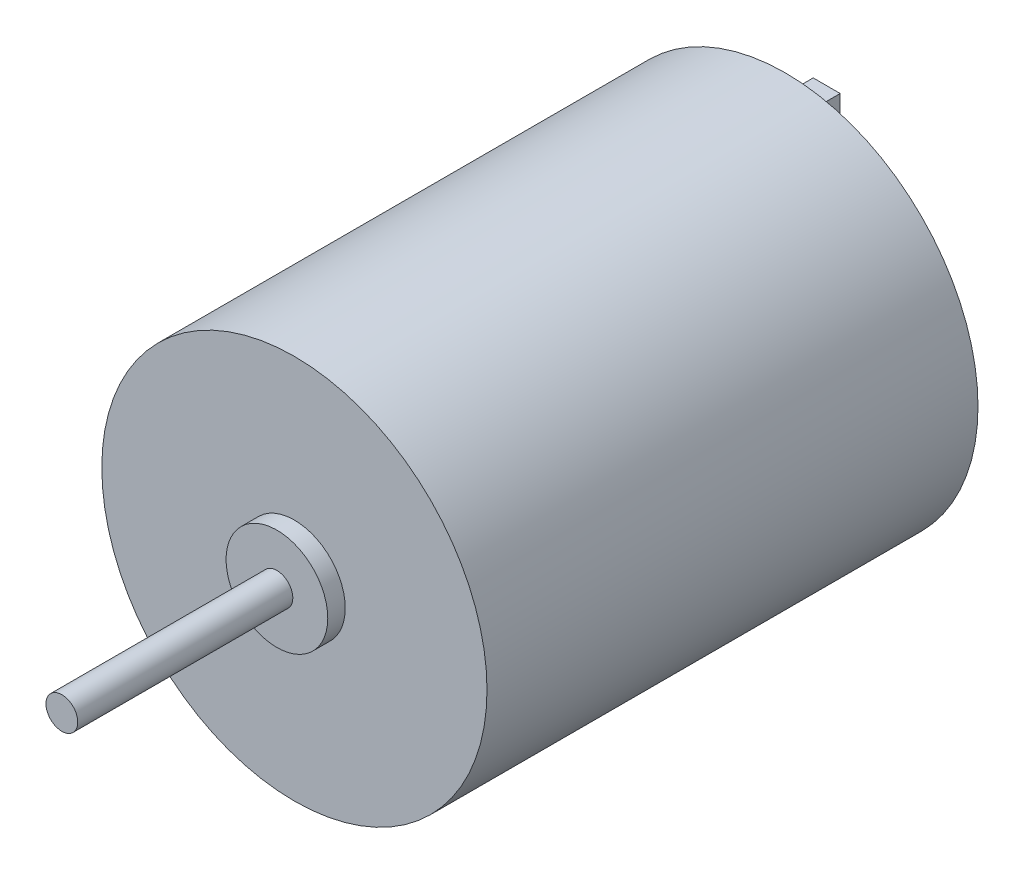
ISO-10303-21;
HEADER;
FILE_DESCRIPTION(('STEP AP214'),'2;1');
FILE_NAME('part.step','',(''),(''),'','','');
FILE_SCHEMA(('AUTOMOTIVE_DESIGN { 1 0 10303 214 1 1 1 1 }'));
ENDSEC;
DATA;
#1=APPLICATION_CONTEXT('core data for automotive mechanical design processes');
#2=APPLICATION_PROTOCOL_DEFINITION('international standard','automotive_design',2000,#1);
#3=PRODUCT_CONTEXT('',#1,'mechanical');
#4=PRODUCT('Part','Part','',(#3));
#5=PRODUCT_RELATED_PRODUCT_CATEGORY('part','',(#4));
#6=PRODUCT_DEFINITION_FORMATION('','',#4);
#7=PRODUCT_DEFINITION_CONTEXT('part definition',#1,'design');
#8=PRODUCT_DEFINITION('design','',#6,#7);
#9=PRODUCT_DEFINITION_SHAPE('','',#8);
#10=(LENGTH_UNIT() NAMED_UNIT(*) SI_UNIT(.MILLI.,.METRE.));
#11=(NAMED_UNIT(*) PLANE_ANGLE_UNIT() SI_UNIT($,.RADIAN.));
#12=(NAMED_UNIT(*) SI_UNIT($,.STERADIAN.) SOLID_ANGLE_UNIT());
#13=UNCERTAINTY_MEASURE_WITH_UNIT(LENGTH_MEASURE(1.E-05),#10,'distance_accuracy_value','');
#14=(GEOMETRIC_REPRESENTATION_CONTEXT(3) GLOBAL_UNCERTAINTY_ASSIGNED_CONTEXT((#13)) GLOBAL_UNIT_ASSIGNED_CONTEXT((#10,
#11,#12)) REPRESENTATION_CONTEXT('',''));
#15=CARTESIAN_POINT('',(0.,0.,0.));
#16=DIRECTION('',(0.,0.,1.));
#17=DIRECTION('',(1.,0.,0.));
#18=AXIS2_PLACEMENT_3D('',#15,#16,#17);
#19=CARTESIAN_POINT('',(0.,0.,0.));
#20=DIRECTION('',(0.,0.,1.));
#21=DIRECTION('',(1.,0.,0.));
#22=AXIS2_PLACEMENT_3D('',#19,#20,#21);
#23=PLANE('',#22);
#24=DIRECTION('',(0.,1.,0.));
#25=VECTOR('',#24,1.);
#26=CARTESIAN_POINT('',(-0.85,-10.125,0.));
#27=LINE('',#26,#25);
#28=CARTESIAN_POINT('',(-0.85,-10.125,0.));
#29=VERTEX_POINT('',#28);
#30=CARTESIAN_POINT('',(-0.85,-8.425,0.));
#31=VERTEX_POINT('',#30);
#32=EDGE_CURVE('E122',#29,#31,#27,.T.);
#33=ORIENTED_EDGE('',*,*,#32,.F.);
#34=DIRECTION('',(-1.,0.,0.));
#35=VECTOR('',#34,1.);
#36=CARTESIAN_POINT('',(0.85,-10.125,0.));
#37=LINE('',#36,#35);
#38=CARTESIAN_POINT('',(0.85,-10.125,0.));
#39=VERTEX_POINT('',#38);
#40=EDGE_CURVE('E135',#39,#29,#37,.T.);
#41=ORIENTED_EDGE('',*,*,#40,.F.);
#42=DIRECTION('',(0.,-1.,0.));
#43=VECTOR('',#42,1.);
#44=CARTESIAN_POINT('',(0.85,-10.125,0.));
#45=LINE('',#44,#43);
#46=CARTESIAN_POINT('',(0.85,-8.425,0.));
#47=VERTEX_POINT('',#46);
#48=EDGE_CURVE('E144',#47,#39,#45,.T.);
#49=ORIENTED_EDGE('',*,*,#48,.F.);
#50=DIRECTION('',(1.,0.,0.));
#51=VECTOR('',#50,1.);
#52=CARTESIAN_POINT('',(0.85,-8.425,0.));
#53=LINE('',#52,#51);
#54=EDGE_CURVE('E125',#31,#47,#53,.T.);
#55=ORIENTED_EDGE('',*,*,#54,.F.);
#56=EDGE_LOOP('',(#33,#41,#49,#55));
#57=FACE_BOUND('',#56,.T.);
#58=CARTESIAN_POINT('',(0.,0.,0.));
#59=DIRECTION('',(0.,0.,1.));
#60=DIRECTION('',(1.,0.,0.));
#61=AXIS2_PLACEMENT_3D('',#58,#59,#60);
#62=CIRCLE('',#61,12.125);
#63=CARTESIAN_POINT('',(-12.125,0.,0.));
#64=VERTEX_POINT('',#63);
#65=EDGE_CURVE('E40',#64,#64,#62,.T.);
#66=ORIENTED_EDGE('',*,*,#65,.F.);
#67=EDGE_LOOP('',(#66));
#68=FACE_BOUND('',#67,.T.);
#69=DIRECTION('',(0.,1.,0.));
#70=VECTOR('',#69,1.);
#71=CARTESIAN_POINT('',(-0.849999999999999,8.425,0.));
#72=LINE('',#71,#70);
#73=CARTESIAN_POINT('',(-0.849999999999999,8.425,0.));
#74=VERTEX_POINT('',#73);
#75=CARTESIAN_POINT('',(-0.849999999999999,10.125,0.));
#76=VERTEX_POINT('',#75);
#77=EDGE_CURVE('E121',#74,#76,#72,.T.);
#78=ORIENTED_EDGE('',*,*,#77,.F.);
#79=DIRECTION('',(-1.,0.,0.));
#80=VECTOR('',#79,1.);
#81=CARTESIAN_POINT('',(0.850000000000002,8.425,0.));
#82=LINE('',#81,#80);
#83=CARTESIAN_POINT('',(0.850000000000002,8.425,0.));
#84=VERTEX_POINT('',#83);
#85=EDGE_CURVE('E118',#84,#74,#82,.T.);
#86=ORIENTED_EDGE('',*,*,#85,.F.);
#87=DIRECTION('',(0.,-1.,0.));
#88=VECTOR('',#87,1.);
#89=CARTESIAN_POINT('',(0.850000000000002,8.425,0.));
#90=LINE('',#89,#88);
#91=CARTESIAN_POINT('',(0.850000000000002,10.125,0.));
#92=VERTEX_POINT('',#91);
#93=EDGE_CURVE('E56',#92,#84,#90,.T.);
#94=ORIENTED_EDGE('',*,*,#93,.F.);
#95=DIRECTION('',(1.,0.,0.));
#96=VECTOR('',#95,1.);
#97=CARTESIAN_POINT('',(0.850000000000002,10.125,0.));
#98=LINE('',#97,#96);
#99=EDGE_CURVE('E51',#76,#92,#98,.T.);
#100=ORIENTED_EDGE('',*,*,#99,.F.);
#101=EDGE_LOOP('',(#78,#86,#94,#100));
#102=FACE_BOUND('',#101,.T.);
#103=ADVANCED_FACE('F36',(#57,#68,#102),#23,.F.);
#104=CARTESIAN_POINT('',(0.,0.,30.91));
#105=DIRECTION('',(0.,0.,-1.));
#106=DIRECTION('',(-1.,0.,0.));
#107=AXIS2_PLACEMENT_3D('',#104,#105,#106);
#108=CYLINDRICAL_SURFACE('',#107,12.125);
#109=CARTESIAN_POINT('',(0.,0.,30.91));
#110=DIRECTION('',(0.,0.,1.));
#111=DIRECTION('',(1.,0.,0.));
#112=AXIS2_PLACEMENT_3D('',#109,#110,#111);
#113=CIRCLE('',#112,12.125);
#114=CARTESIAN_POINT('',(-12.125,0.,30.91));
#115=VERTEX_POINT('',#114);
#116=EDGE_CURVE('E11',#115,#115,#113,.T.);
#117=CARTESIAN_POINT('',(-12.125,0.,30.91));
#118=CARTESIAN_POINT('',(-12.125,0.,30.5880208333333));
#119=CARTESIAN_POINT('',(-12.125,0.,30.2660416666667));
#120=CARTESIAN_POINT('',(-12.125,0.,29.6220833333333));
#121=CARTESIAN_POINT('',(-12.125,0.,29.3001041666667));
#122=CARTESIAN_POINT('',(-12.125,0.,28.6561458333333));
#123=CARTESIAN_POINT('',(-12.125,0.,28.3341666666667));
#124=CARTESIAN_POINT('',(-12.125,0.,27.6902083333333));
#125=CARTESIAN_POINT('',(-12.125,0.,27.3682291666667));
#126=CARTESIAN_POINT('',(-12.125,0.,26.7242708333333));
#127=CARTESIAN_POINT('',(-12.125,0.,26.4022916666667));
#128=CARTESIAN_POINT('',(-12.125,0.,25.7583333333333));
#129=CARTESIAN_POINT('',(-12.125,0.,25.4363541666667));
#130=CARTESIAN_POINT('',(-12.125,0.,24.7923958333333));
#131=CARTESIAN_POINT('',(-12.125,0.,24.4704166666667));
#132=CARTESIAN_POINT('',(-12.125,0.,23.8264583333333));
#133=CARTESIAN_POINT('',(-12.125,0.,23.5044791666667));
#134=CARTESIAN_POINT('',(-12.125,0.,22.8605208333333));
#135=CARTESIAN_POINT('',(-12.125,0.,22.5385416666667));
#136=CARTESIAN_POINT('',(-12.125,0.,21.8945833333333));
#137=CARTESIAN_POINT('',(-12.125,0.,21.5726041666667));
#138=CARTESIAN_POINT('',(-12.125,0.,20.9286458333333));
#139=CARTESIAN_POINT('',(-12.125,0.,20.6066666666667));
#140=CARTESIAN_POINT('',(-12.125,0.,19.9627083333333));
#141=CARTESIAN_POINT('',(-12.125,0.,19.6407291666667));
#142=CARTESIAN_POINT('',(-12.125,0.,18.9967708333333));
#143=CARTESIAN_POINT('',(-12.125,0.,18.6747916666667));
#144=CARTESIAN_POINT('',(-12.125,0.,18.0308333333333));
#145=CARTESIAN_POINT('',(-12.125,0.,17.7088541666667));
#146=CARTESIAN_POINT('',(-12.125,0.,17.0648958333333));
#147=CARTESIAN_POINT('',(-12.125,0.,16.7429166666667));
#148=CARTESIAN_POINT('',(-12.125,0.,16.0989583333333));
#149=CARTESIAN_POINT('',(-12.125,0.,15.7769791666667));
#150=CARTESIAN_POINT('',(-12.125,0.,15.1330208333333));
#151=CARTESIAN_POINT('',(-12.125,0.,14.8110416666667));
#152=CARTESIAN_POINT('',(-12.125,0.,14.1670833333333));
#153=CARTESIAN_POINT('',(-12.125,0.,13.8451041666667));
#154=CARTESIAN_POINT('',(-12.125,0.,13.2011458333333));
#155=CARTESIAN_POINT('',(-12.125,0.,12.8791666666667));
#156=CARTESIAN_POINT('',(-12.125,0.,12.2352083333333));
#157=CARTESIAN_POINT('',(-12.125,0.,11.9132291666667));
#158=CARTESIAN_POINT('',(-12.125,0.,11.2692708333333));
#159=CARTESIAN_POINT('',(-12.125,0.,10.9472916666667));
#160=CARTESIAN_POINT('',(-12.125,0.,10.3033333333333));
#161=CARTESIAN_POINT('',(-12.125,0.,9.98135416666666));
#162=CARTESIAN_POINT('',(-12.125,0.,9.33739583333333));
#163=CARTESIAN_POINT('',(-12.125,0.,9.01541666666667));
#164=CARTESIAN_POINT('',(-12.125,0.,8.37145833333333));
#165=CARTESIAN_POINT('',(-12.125,0.,8.04947916666666));
#166=CARTESIAN_POINT('',(-12.125,0.,7.40552083333333));
#167=CARTESIAN_POINT('',(-12.125,0.,7.08354166666667));
#168=CARTESIAN_POINT('',(-12.125,0.,6.43958333333333));
#169=CARTESIAN_POINT('',(-12.125,0.,6.11760416666667));
#170=CARTESIAN_POINT('',(-12.125,0.,5.47364583333333));
#171=CARTESIAN_POINT('',(-12.125,0.,5.15166666666667));
#172=CARTESIAN_POINT('',(-12.125,0.,4.50770833333333));
#173=CARTESIAN_POINT('',(-12.125,0.,4.18572916666666));
#174=CARTESIAN_POINT('',(-12.125,0.,3.54177083333333));
#175=CARTESIAN_POINT('',(-12.125,0.,3.21979166666666));
#176=CARTESIAN_POINT('',(-12.125,0.,2.57583333333333));
#177=CARTESIAN_POINT('',(-12.125,0.,2.25385416666666));
#178=CARTESIAN_POINT('',(-12.125,0.,1.60989583333333));
#179=CARTESIAN_POINT('',(-12.125,0.,1.28791666666666));
#180=CARTESIAN_POINT('',(-12.125,0.,0.64395833333333));
#181=CARTESIAN_POINT('',(-12.125,0.,0.321979166666663));
#182=CARTESIAN_POINT('',(-12.125,0.,0.));
#183=B_SPLINE_CURVE_WITH_KNOTS('',3,(#117,#118,#119,#120,#121,#122,#123,#124,#125,#126,#127,
#128,#129,#130,#131,#132,#133,#134,#135,#136,#137,#138,#139,#140,#141,#142,#143,#144,#145,#146,
#147,#148,#149,#150,#151,#152,#153,#154,#155,#156,#157,#158,#159,#160,#161,#162,#163,#164,#165,
#166,#167,#168,#169,#170,#171,#172,#173,#174,#175,#176,#177,#178,#179,#180,#181,#182),
.UNSPECIFIED.,.F.,.F.,(4,2,2,2,2,2,2,2,2,2,2,2,2,2,2,2,2,2,2,2,2,2,2,2,2,2,2,2,2,2,2,2,4),(0.,
0.965937500000003,1.931875,2.8978125,3.86375,4.8296875,5.795625,6.7615625,7.7275,8.6934375,
9.659375,10.6253125,11.59125,12.5571875,13.523125,14.4890625,15.455,16.4209375,17.386875,
18.3528125,19.31875,20.2846875,21.250625,22.2165625,23.1825,24.1484375,25.114375,26.0803125,
27.04625,28.0121875,28.978125,29.9440625,30.91),.UNSPECIFIED.);
#184=EDGE_CURVE('BSEAM38',#115,#64,#183,.T.);
#185=ORIENTED_EDGE('',*,*,#116,.F.);
#186=ORIENTED_EDGE('',*,*,#65,.T.);
#187=ORIENTED_EDGE('',*,*,#184,.T.);
#188=ORIENTED_EDGE('',*,*,#184,.F.);
#189=EDGE_LOOP('',(#185,#187,#186,#188));
#190=FACE_BOUND('',#189,.T.);
#191=ADVANCED_FACE('F38',(#190),#108,.T.);
#192=CARTESIAN_POINT('',(0.,0.,30.91));
#193=DIRECTION('',(0.,0.,1.));
#194=DIRECTION('',(1.,0.,0.));
#195=AXIS2_PLACEMENT_3D('',#192,#193,#194);
#196=PLANE('',#195);
#197=CARTESIAN_POINT('',(0.,0.,30.91));
#198=DIRECTION('',(0.,0.,1.));
#199=DIRECTION('',(1.,0.,0.));
#200=AXIS2_PLACEMENT_3D('',#197,#198,#199);
#201=CIRCLE('',#200,3.2);
#202=CARTESIAN_POINT('',(3.2,0.,30.91));
#203=VERTEX_POINT('',#202);
#204=EDGE_CURVE('E164',#203,#203,#201,.T.);
#205=ORIENTED_EDGE('',*,*,#204,.F.);
#206=EDGE_LOOP('',(#205));
#207=FACE_BOUND('',#206,.T.);
#208=ORIENTED_EDGE('',*,*,#116,.T.);
#209=EDGE_LOOP('',(#208));
#210=FACE_BOUND('',#209,.T.);
#211=ADVANCED_FACE('F175',(#207,#210),#196,.T.);
#212=CARTESIAN_POINT('',(0.,0.,32.01));
#213=DIRECTION('',(0.,0.,-1.));
#214=DIRECTION('',(-1.,0.,0.));
#215=AXIS2_PLACEMENT_3D('',#212,#213,#214);
#216=CYLINDRICAL_SURFACE('',#215,3.2);
#217=CARTESIAN_POINT('',(0.,0.,32.01));
#218=DIRECTION('',(0.,0.,1.));
#219=DIRECTION('',(1.,0.,0.));
#220=AXIS2_PLACEMENT_3D('',#217,#218,#219);
#221=CIRCLE('',#220,3.2);
#222=CARTESIAN_POINT('',(3.2,0.,32.01));
#223=VERTEX_POINT('',#222);
#224=EDGE_CURVE('E167',#223,#223,#221,.T.);
#225=ORIENTED_EDGE('',*,*,#224,.F.);
#226=EDGE_LOOP('',(#225));
#227=FACE_BOUND('',#226,.T.);
#228=ORIENTED_EDGE('',*,*,#204,.T.);
#229=EDGE_LOOP('',(#228));
#230=FACE_BOUND('',#229,.T.);
#231=ADVANCED_FACE('F173',(#227,#230),#216,.T.);
#232=CARTESIAN_POINT('',(0.,0.,32.01));
#233=DIRECTION('',(0.,0.,1.));
#234=DIRECTION('',(1.,0.,0.));
#235=AXIS2_PLACEMENT_3D('',#232,#233,#234);
#236=PLANE('',#235);
#237=CARTESIAN_POINT('',(0.,0.,32.01));
#238=DIRECTION('',(0.,0.,1.));
#239=DIRECTION('',(1.,0.,0.));
#240=AXIS2_PLACEMENT_3D('',#237,#238,#239);
#241=CIRCLE('',#240,1.);
#242=CARTESIAN_POINT('',(1.,0.,32.01));
#243=VERTEX_POINT('',#242);
#244=EDGE_CURVE('E160',#243,#243,#241,.T.);
#245=ORIENTED_EDGE('',*,*,#244,.F.);
#246=EDGE_LOOP('',(#245));
#247=FACE_BOUND('',#246,.T.);
#248=ORIENTED_EDGE('',*,*,#224,.T.);
#249=EDGE_LOOP('',(#248));
#250=FACE_BOUND('',#249,.T.);
#251=ADVANCED_FACE('F242',(#247,#250),#236,.T.);
#252=CARTESIAN_POINT('',(0.,0.,45.55));
#253=DIRECTION('',(0.,0.,-1.));
#254=DIRECTION('',(-1.,0.,0.));
#255=AXIS2_PLACEMENT_3D('',#252,#253,#254);
#256=CYLINDRICAL_SURFACE('',#255,1.);
#257=CARTESIAN_POINT('',(0.,0.,45.55));
#258=DIRECTION('',(0.,0.,1.));
#259=DIRECTION('',(1.,0.,0.));
#260=AXIS2_PLACEMENT_3D('',#257,#258,#259);
#261=CIRCLE('',#260,1.);
#262=CARTESIAN_POINT('',(1.,0.,45.55));
#263=VERTEX_POINT('',#262);
#264=EDGE_CURVE('E161',#263,#263,#261,.T.);
#265=ORIENTED_EDGE('',*,*,#264,.F.);
#266=EDGE_LOOP('',(#265));
#267=FACE_BOUND('',#266,.T.);
#268=ORIENTED_EDGE('',*,*,#244,.T.);
#269=EDGE_LOOP('',(#268));
#270=FACE_BOUND('',#269,.T.);
#271=ADVANCED_FACE('F238',(#267,#270),#256,.T.);
#272=CARTESIAN_POINT('',(0.,0.,45.55));
#273=DIRECTION('',(0.,0.,1.));
#274=DIRECTION('',(1.,0.,0.));
#275=AXIS2_PLACEMENT_3D('',#272,#273,#274);
#276=PLANE('',#275);
#277=ORIENTED_EDGE('',*,*,#264,.T.);
#278=EDGE_LOOP('',(#277));
#279=FACE_BOUND('',#278,.T.);
#280=ADVANCED_FACE('F234',(#279),#276,.T.);
#281=CARTESIAN_POINT('',(-0.85,-10.125,-2.6));
#282=DIRECTION('',(1.,0.,0.));
#283=DIRECTION('',(0.,0.,-1.));
#284=AXIS2_PLACEMENT_3D('',#281,#282,#283);
#285=PLANE('',#284);
#286=ORIENTED_EDGE('',*,*,#32,.T.);
#287=DIRECTION('',(0.,0.,1.));
#288=VECTOR('',#287,1.);
#289=CARTESIAN_POINT('',(-0.85,-8.425,-2.6));
#290=LINE('',#289,#288);
#291=CARTESIAN_POINT('',(-0.85,-8.425,-2.6));
#292=VERTEX_POINT('',#291);
#293=EDGE_CURVE('E157',#292,#31,#290,.T.);
#294=ORIENTED_EDGE('',*,*,#293,.F.);
#295=DIRECTION('',(0.,1.,0.));
#296=VECTOR('',#295,1.);
#297=CARTESIAN_POINT('',(-0.85,-10.125,-2.6));
#298=LINE('',#297,#296);
#299=CARTESIAN_POINT('',(-0.85,-10.125,-2.6));
#300=VERTEX_POINT('',#299);
#301=EDGE_CURVE('E131',#300,#292,#298,.T.);
#302=ORIENTED_EDGE('',*,*,#301,.F.);
#303=DIRECTION('',(0.,0.,1.));
#304=VECTOR('',#303,1.);
#305=CARTESIAN_POINT('',(-0.85,-10.125,-2.6));
#306=LINE('',#305,#304);
#307=EDGE_CURVE('E140',#300,#29,#306,.T.);
#308=ORIENTED_EDGE('',*,*,#307,.T.);
#309=EDGE_LOOP('',(#286,#294,#302,#308));
#310=FACE_BOUND('',#309,.T.);
#311=ADVANCED_FACE('F230',(#310),#285,.F.);
#312=CARTESIAN_POINT('',(0.85,-8.425,-2.6));
#313=DIRECTION('',(0.,-1.,0.));
#314=DIRECTION('',(0.,0.,-1.));
#315=AXIS2_PLACEMENT_3D('',#312,#313,#314);
#316=PLANE('',#315);
#317=ORIENTED_EDGE('',*,*,#54,.T.);
#318=DIRECTION('',(0.,0.,1.));
#319=VECTOR('',#318,1.);
#320=CARTESIAN_POINT('',(0.85,-8.425,-2.6));
#321=LINE('',#320,#319);
#322=CARTESIAN_POINT('',(0.85,-8.425,-2.6));
#323=VERTEX_POINT('',#322);
#324=EDGE_CURVE('E154',#323,#47,#321,.T.);
#325=ORIENTED_EDGE('',*,*,#324,.F.);
#326=DIRECTION('',(1.,0.,0.));
#327=VECTOR('',#326,1.);
#328=CARTESIAN_POINT('',(0.85,-8.425,-2.6));
#329=LINE('',#328,#327);
#330=EDGE_CURVE('E134',#292,#323,#329,.T.);
#331=ORIENTED_EDGE('',*,*,#330,.F.);
#332=ORIENTED_EDGE('',*,*,#293,.T.);
#333=EDGE_LOOP('',(#317,#325,#331,#332));
#334=FACE_BOUND('',#333,.T.);
#335=ADVANCED_FACE('F226',(#334),#316,.F.);
#336=CARTESIAN_POINT('',(0.85,-10.125,-2.6));
#337=DIRECTION('',(-1.,0.,0.));
#338=DIRECTION('',(0.,0.,1.));
#339=AXIS2_PLACEMENT_3D('',#336,#337,#338);
#340=PLANE('',#339);
#341=ORIENTED_EDGE('',*,*,#48,.T.);
#342=DIRECTION('',(0.,0.,1.));
#343=VECTOR('',#342,1.);
#344=CARTESIAN_POINT('',(0.85,-10.125,-2.6));
#345=LINE('',#344,#343);
#346=CARTESIAN_POINT('',(0.85,-10.125,-2.6));
#347=VERTEX_POINT('',#346);
#348=EDGE_CURVE('E151',#347,#39,#345,.T.);
#349=ORIENTED_EDGE('',*,*,#348,.F.);
#350=DIRECTION('',(0.,-1.,0.));
#351=VECTOR('',#350,1.);
#352=CARTESIAN_POINT('',(0.85,-10.125,-2.6));
#353=LINE('',#352,#351);
#354=EDGE_CURVE('E137',#323,#347,#353,.T.);
#355=ORIENTED_EDGE('',*,*,#354,.F.);
#356=ORIENTED_EDGE('',*,*,#324,.T.);
#357=EDGE_LOOP('',(#341,#349,#355,#356));
#358=FACE_BOUND('',#357,.T.);
#359=ADVANCED_FACE('F222',(#358),#340,.F.);
#360=CARTESIAN_POINT('',(0.85,-10.125,-2.6));
#361=DIRECTION('',(0.,1.,0.));
#362=DIRECTION('',(0.,0.,1.));
#363=AXIS2_PLACEMENT_3D('',#360,#361,#362);
#364=PLANE('',#363);
#365=ORIENTED_EDGE('',*,*,#40,.T.);
#366=ORIENTED_EDGE('',*,*,#307,.F.);
#367=DIRECTION('',(-1.,0.,0.));
#368=VECTOR('',#367,1.);
#369=CARTESIAN_POINT('',(0.85,-10.125,-2.6));
#370=LINE('',#369,#368);
#371=EDGE_CURVE('E139',#347,#300,#370,.T.);
#372=ORIENTED_EDGE('',*,*,#371,.F.);
#373=ORIENTED_EDGE('',*,*,#348,.T.);
#374=EDGE_LOOP('',(#365,#366,#372,#373));
#375=FACE_BOUND('',#374,.T.);
#376=ADVANCED_FACE('F218',(#375),#364,.F.);
#377=CARTESIAN_POINT('',(0.,0.,-2.6));
#378=DIRECTION('',(0.,0.,1.));
#379=DIRECTION('',(1.,0.,0.));
#380=AXIS2_PLACEMENT_3D('',#377,#378,#379);
#381=PLANE('',#380);
#382=ORIENTED_EDGE('',*,*,#301,.T.);
#383=ORIENTED_EDGE('',*,*,#330,.T.);
#384=ORIENTED_EDGE('',*,*,#354,.T.);
#385=ORIENTED_EDGE('',*,*,#371,.T.);
#386=EDGE_LOOP('',(#382,#383,#384,#385));
#387=FACE_BOUND('',#386,.T.);
#388=ADVANCED_FACE('F215',(#387),#381,.F.);
#389=CARTESIAN_POINT('',(-0.849999999999999,8.425,-2.6));
#390=DIRECTION('',(1.,0.,0.));
#391=DIRECTION('',(0.,0.,-1.));
#392=AXIS2_PLACEMENT_3D('',#389,#390,#391);
#393=PLANE('',#392);
#394=ORIENTED_EDGE('',*,*,#77,.T.);
#395=DIRECTION('',(0.,0.,1.));
#396=VECTOR('',#395,1.);
#397=CARTESIAN_POINT('',(-0.849999999999999,10.125,-2.6));
#398=LINE('',#397,#396);
#399=CARTESIAN_POINT('',(-0.849999999999999,10.125,-2.6));
#400=VERTEX_POINT('',#399);
#401=EDGE_CURVE('E102',#400,#76,#398,.T.);
#402=ORIENTED_EDGE('',*,*,#401,.F.);
#403=DIRECTION('',(0.,1.,0.));
#404=VECTOR('',#403,1.);
#405=CARTESIAN_POINT('',(-0.849999999999999,8.425,-2.6));
#406=LINE('',#405,#404);
#407=CARTESIAN_POINT('',(-0.849999999999999,8.425,-2.6));
#408=VERTEX_POINT('',#407);
#409=EDGE_CURVE('E109',#408,#400,#406,.T.);
#410=ORIENTED_EDGE('',*,*,#409,.F.);
#411=DIRECTION('',(0.,0.,1.));
#412=VECTOR('',#411,1.);
#413=CARTESIAN_POINT('',(-0.849999999999999,8.425,-2.6));
#414=LINE('',#413,#412);
#415=EDGE_CURVE('E193',#408,#74,#414,.T.);
#416=ORIENTED_EDGE('',*,*,#415,.T.);
#417=EDGE_LOOP('',(#394,#402,#410,#416));
#418=FACE_BOUND('',#417,.T.);
#419=ADVANCED_FACE('F120',(#418),#393,.F.);
#420=CARTESIAN_POINT('',(0.850000000000002,10.125,-2.6));
#421=DIRECTION('',(0.,-1.,0.));
#422=DIRECTION('',(0.,0.,-1.));
#423=AXIS2_PLACEMENT_3D('',#420,#421,#422);
#424=PLANE('',#423);
#425=ORIENTED_EDGE('',*,*,#99,.T.);
#426=DIRECTION('',(0.,0.,1.));
#427=VECTOR('',#426,1.);
#428=CARTESIAN_POINT('',(0.850000000000002,10.125,-2.6));
#429=LINE('',#428,#427);
#430=CARTESIAN_POINT('',(0.850000000000002,10.125,-2.6));
#431=VERTEX_POINT('',#430);
#432=EDGE_CURVE('E105',#431,#92,#429,.T.);
#433=ORIENTED_EDGE('',*,*,#432,.F.);
#434=DIRECTION('',(1.,0.,0.));
#435=VECTOR('',#434,1.);
#436=CARTESIAN_POINT('',(0.850000000000002,10.125,-2.6));
#437=LINE('',#436,#435);
#438=EDGE_CURVE('E98',#400,#431,#437,.T.);
#439=ORIENTED_EDGE('',*,*,#438,.F.);
#440=ORIENTED_EDGE('',*,*,#401,.T.);
#441=EDGE_LOOP('',(#425,#433,#439,#440));
#442=FACE_BOUND('',#441,.T.);
#443=ADVANCED_FACE('F100',(#442),#424,.F.);
#444=CARTESIAN_POINT('',(0.850000000000002,8.425,-2.6));
#445=DIRECTION('',(-1.,0.,0.));
#446=DIRECTION('',(0.,0.,1.));
#447=AXIS2_PLACEMENT_3D('',#444,#445,#446);
#448=PLANE('',#447);
#449=ORIENTED_EDGE('',*,*,#93,.T.);
#450=DIRECTION('',(0.,0.,1.));
#451=VECTOR('',#450,1.);
#452=CARTESIAN_POINT('',(0.850000000000002,8.425,-2.6));
#453=LINE('',#452,#451);
#454=CARTESIAN_POINT('',(0.850000000000002,8.425,-2.6));
#455=VERTEX_POINT('',#454);
#456=EDGE_CURVE('E127',#455,#84,#453,.T.);
#457=ORIENTED_EDGE('',*,*,#456,.F.);
#458=DIRECTION('',(0.,-1.,0.));
#459=VECTOR('',#458,1.);
#460=CARTESIAN_POINT('',(0.850000000000002,8.425,-2.6));
#461=LINE('',#460,#459);
#462=EDGE_CURVE('E108',#431,#455,#461,.T.);
#463=ORIENTED_EDGE('',*,*,#462,.F.);
#464=ORIENTED_EDGE('',*,*,#432,.T.);
#465=EDGE_LOOP('',(#449,#457,#463,#464));
#466=FACE_BOUND('',#465,.T.);
#467=ADVANCED_FACE('F202',(#466),#448,.F.);
#468=CARTESIAN_POINT('',(0.850000000000002,8.425,-2.6));
#469=DIRECTION('',(0.,1.,0.));
#470=DIRECTION('',(0.,0.,1.));
#471=AXIS2_PLACEMENT_3D('',#468,#469,#470);
#472=PLANE('',#471);
#473=ORIENTED_EDGE('',*,*,#85,.T.);
#474=ORIENTED_EDGE('',*,*,#415,.F.);
#475=DIRECTION('',(-1.,0.,0.));
#476=VECTOR('',#475,1.);
#477=CARTESIAN_POINT('',(0.850000000000002,8.425,-2.6));
#478=LINE('',#477,#476);
#479=EDGE_CURVE('E114',#455,#408,#478,.T.);
#480=ORIENTED_EDGE('',*,*,#479,.F.);
#481=ORIENTED_EDGE('',*,*,#456,.T.);
#482=EDGE_LOOP('',(#473,#474,#480,#481));
#483=FACE_BOUND('',#482,.T.);
#484=ADVANCED_FACE('F192',(#483),#472,.F.);
#485=CARTESIAN_POINT('',(0.,0.,-2.6));
#486=DIRECTION('',(0.,0.,1.));
#487=DIRECTION('',(1.,0.,0.));
#488=AXIS2_PLACEMENT_3D('',#485,#486,#487);
#489=PLANE('',#488);
#490=ORIENTED_EDGE('',*,*,#409,.T.);
#491=ORIENTED_EDGE('',*,*,#438,.T.);
#492=ORIENTED_EDGE('',*,*,#462,.T.);
#493=ORIENTED_EDGE('',*,*,#479,.T.);
#494=EDGE_LOOP('',(#490,#491,#492,#493));
#495=FACE_BOUND('',#494,.T.);
#496=ADVANCED_FACE('F112',(#495),#489,.F.);
#497=CLOSED_SHELL('',(#103,#191,#211,#231,#251,#271,#280,#311,#335,#359,#376,#388,#419,#443,
#467,#484,#496));
#498=MANIFOLD_SOLID_BREP('B2',#497);
#499=ADVANCED_BREP_SHAPE_REPRESENTATION('',(#18,#498),#14);
#500=SHAPE_DEFINITION_REPRESENTATION(#9,#499);
ENDSEC;
END-ISO-10303-21;
